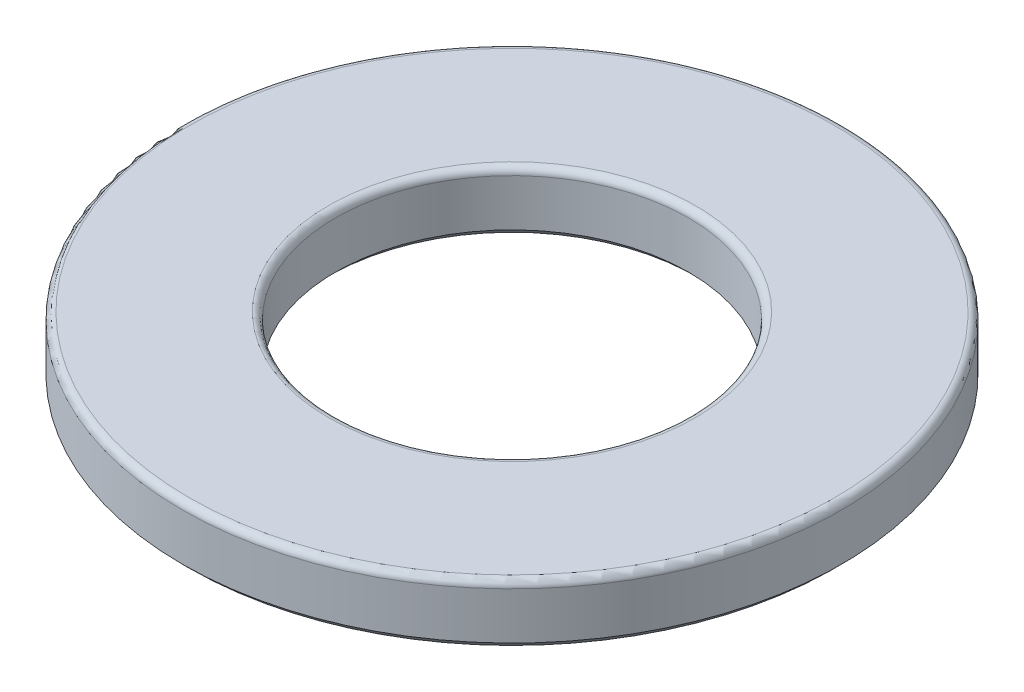
ISO-10303-21;
HEADER;
FILE_DESCRIPTION(('STEP AP214'),'2;1');
FILE_NAME('part.step','',(''),(''),'','','');
FILE_SCHEMA(('AUTOMOTIVE_DESIGN { 1 0 10303 214 1 1 1 1 }'));
ENDSEC;
DATA;
#1=APPLICATION_CONTEXT('core data for automotive mechanical design processes');
#2=APPLICATION_PROTOCOL_DEFINITION('international standard','automotive_design',2000,#1);
#3=PRODUCT_CONTEXT('',#1,'mechanical');
#4=PRODUCT('Part','Part','',(#3));
#5=PRODUCT_RELATED_PRODUCT_CATEGORY('part','',(#4));
#6=PRODUCT_DEFINITION_FORMATION('','',#4);
#7=PRODUCT_DEFINITION_CONTEXT('part definition',#1,'design');
#8=PRODUCT_DEFINITION('design','',#6,#7);
#9=PRODUCT_DEFINITION_SHAPE('','',#8);
#10=(LENGTH_UNIT() NAMED_UNIT(*) SI_UNIT(.MILLI.,.METRE.));
#11=(NAMED_UNIT(*) PLANE_ANGLE_UNIT() SI_UNIT($,.RADIAN.));
#12=(NAMED_UNIT(*) SI_UNIT($,.STERADIAN.) SOLID_ANGLE_UNIT());
#13=UNCERTAINTY_MEASURE_WITH_UNIT(LENGTH_MEASURE(1.E-05),#10,'distance_accuracy_value','');
#14=(GEOMETRIC_REPRESENTATION_CONTEXT(3) GLOBAL_UNCERTAINTY_ASSIGNED_CONTEXT((#13)) GLOBAL_UNIT_ASSIGNED_CONTEXT((#10,
#11,#12)) REPRESENTATION_CONTEXT('',''));
#15=CARTESIAN_POINT('',(0.,0.,0.));
#16=DIRECTION('',(0.,0.,1.));
#17=DIRECTION('',(1.,0.,0.));
#18=AXIS2_PLACEMENT_3D('',#15,#16,#17);
#19=CARTESIAN_POINT('',(0.,8.7,0.));
#20=DIRECTION('',(0.,1.,0.));
#21=DIRECTION('',(0.,0.,1.));
#22=AXIS2_PLACEMENT_3D('',#19,#20,#21);
#23=TOROIDAL_SURFACE('',#22,13.7,0.3);
#24=CARTESIAN_POINT('',(0.,8.7,0.));
#25=DIRECTION('',(0.,1.,0.));
#26=DIRECTION('',(0.,0.,1.));
#27=AXIS2_PLACEMENT_3D('',#24,#25,#26);
#28=CIRCLE('',#27,14.);
#29=CARTESIAN_POINT('',(0.,8.7,14.));
#30=VERTEX_POINT('',#29);
#31=EDGE_CURVE('E10',#30,#30,#28,.T.);
#32=ORIENTED_EDGE('',*,*,#31,.T.);
#33=EDGE_LOOP('',(#32));
#34=FACE_BOUND('',#33,.T.);
#35=CARTESIAN_POINT('',(0.,9.,0.));
#36=DIRECTION('',(0.,1.,0.));
#37=DIRECTION('',(0.,0.,1.));
#38=AXIS2_PLACEMENT_3D('',#35,#36,#37);
#39=CIRCLE('',#38,13.7);
#40=CARTESIAN_POINT('',(0.,9.,13.7));
#41=VERTEX_POINT('',#40);
#42=EDGE_CURVE('E64',#41,#41,#39,.T.);
#43=ORIENTED_EDGE('',*,*,#42,.F.);
#44=EDGE_LOOP('',(#43));
#45=FACE_BOUND('',#44,.T.);
#46=ADVANCED_FACE('F14',(#34,#45),#23,.T.);
#47=CARTESIAN_POINT('',(0.,9.,0.));
#48=DIRECTION('',(0.,1.,0.));
#49=DIRECTION('',(0.,0.,1.));
#50=AXIS2_PLACEMENT_3D('',#47,#48,#49);
#51=CYLINDRICAL_SURFACE('',#50,14.);
#52=CARTESIAN_POINT('',(0.,6.7048,0.));
#53=DIRECTION('',(0.,1.,0.));
#54=DIRECTION('',(0.,0.,1.));
#55=AXIS2_PLACEMENT_3D('',#52,#53,#54);
#56=CIRCLE('',#55,14.);
#57=CARTESIAN_POINT('',(0.,6.7048,14.));
#58=VERTEX_POINT('',#57);
#59=EDGE_CURVE('E21',#58,#58,#56,.T.);
#60=ORIENTED_EDGE('',*,*,#59,.T.);
#61=EDGE_LOOP('',(#60));
#62=FACE_BOUND('',#61,.T.);
#63=ORIENTED_EDGE('',*,*,#31,.F.);
#64=EDGE_LOOP('',(#63));
#65=FACE_BOUND('',#64,.T.);
#66=ADVANCED_FACE('F73',(#62,#65),#51,.T.);
#67=CARTESIAN_POINT('',(0.,6.4048,0.));
#68=DIRECTION('',(0.,1.,0.));
#69=DIRECTION('',(0.,0.,1.));
#70=AXIS2_PLACEMENT_3D('',#67,#68,#69);
#71=CONICAL_SURFACE('',#70,13.7,0.785398163397449);
#72=ORIENTED_EDGE('',*,*,#59,.F.);
#73=EDGE_LOOP('',(#72));
#74=FACE_BOUND('',#73,.T.);
#75=CARTESIAN_POINT('',(0.,6.4048,0.));
#76=DIRECTION('',(0.,1.,0.));
#77=DIRECTION('',(0.,0.,1.));
#78=AXIS2_PLACEMENT_3D('',#75,#76,#77);
#79=CIRCLE('',#78,13.7);
#80=CARTESIAN_POINT('',(0.,6.4048,13.7));
#81=VERTEX_POINT('',#80);
#82=EDGE_CURVE('E30',#81,#81,#79,.T.);
#83=ORIENTED_EDGE('',*,*,#82,.T.);
#84=EDGE_LOOP('',(#83));
#85=FACE_BOUND('',#84,.T.);
#86=ADVANCED_FACE('F78',(#74,#85),#71,.T.);
#87=CARTESIAN_POINT('',(12.1786,6.4048,0.));
#88=DIRECTION('',(0.,1.,0.));
#89=DIRECTION('',(0.,0.,1.));
#90=AXIS2_PLACEMENT_3D('',#87,#88,#89);
#91=PLANE('',#90);
#92=ORIENTED_EDGE('',*,*,#82,.F.);
#93=EDGE_LOOP('',(#92));
#94=FACE_BOUND('',#93,.T.);
#95=CARTESIAN_POINT('',(0.,6.4048,0.));
#96=DIRECTION('',(0.,1.,0.));
#97=DIRECTION('',(0.,0.,1.));
#98=AXIS2_PLACEMENT_3D('',#95,#96,#97);
#99=CIRCLE('',#98,12.1786);
#100=CARTESIAN_POINT('',(0.,6.4048,12.1786));
#101=VERTEX_POINT('',#100);
#102=EDGE_CURVE('E38',#101,#101,#99,.T.);
#103=ORIENTED_EDGE('',*,*,#102,.T.);
#104=EDGE_LOOP('',(#103));
#105=FACE_BOUND('',#104,.T.);
#106=ADVANCED_FACE('F82',(#94,#105),#91,.F.);
#107=CARTESIAN_POINT('',(0.,4.5,0.));
#108=DIRECTION('',(0.,1.,0.));
#109=DIRECTION('',(0.,0.,1.));
#110=AXIS2_PLACEMENT_3D('',#107,#108,#109);
#111=TOROIDAL_SURFACE('',#110,10.75,2.381);
#112=ORIENTED_EDGE('',*,*,#102,.F.);
#113=EDGE_LOOP('',(#112));
#114=FACE_BOUND('',#113,.T.);
#115=CARTESIAN_POINT('',(0.,6.4048,0.));
#116=DIRECTION('',(0.,1.,0.));
#117=DIRECTION('',(0.,0.,1.));
#118=AXIS2_PLACEMENT_3D('',#115,#116,#117);
#119=CIRCLE('',#118,9.3214);
#120=CARTESIAN_POINT('',(0.,6.4048,9.3214));
#121=VERTEX_POINT('',#120);
#122=EDGE_CURVE('E44',#121,#121,#119,.T.);
#123=ORIENTED_EDGE('',*,*,#122,.T.);
#124=EDGE_LOOP('',(#123));
#125=FACE_BOUND('',#124,.T.);
#126=ADVANCED_FACE('F89',(#114,#125),#111,.F.);
#127=CARTESIAN_POINT('',(7.8,6.4048,0.));
#128=DIRECTION('',(0.,1.,0.));
#129=DIRECTION('',(0.,0.,1.));
#130=AXIS2_PLACEMENT_3D('',#127,#128,#129);
#131=PLANE('',#130);
#132=ORIENTED_EDGE('',*,*,#122,.F.);
#133=EDGE_LOOP('',(#132));
#134=FACE_BOUND('',#133,.T.);
#135=CARTESIAN_POINT('',(0.,6.4048,0.));
#136=DIRECTION('',(0.,1.,0.));
#137=DIRECTION('',(0.,0.,1.));
#138=AXIS2_PLACEMENT_3D('',#135,#136,#137);
#139=CIRCLE('',#138,7.8);
#140=CARTESIAN_POINT('',(0.,6.4048,7.8));
#141=VERTEX_POINT('',#140);
#142=EDGE_CURVE('E48',#141,#141,#139,.T.);
#143=ORIENTED_EDGE('',*,*,#142,.T.);
#144=EDGE_LOOP('',(#143));
#145=FACE_BOUND('',#144,.T.);
#146=ADVANCED_FACE('F93',(#134,#145),#131,.F.);
#147=CARTESIAN_POINT('',(0.,6.7048,0.));
#148=DIRECTION('',(0.,-1.,0.));
#149=DIRECTION('',(0.,0.,-1.));
#150=AXIS2_PLACEMENT_3D('',#147,#148,#149);
#151=CONICAL_SURFACE('',#150,7.5,0.78539816339745);
#152=ORIENTED_EDGE('',*,*,#142,.F.);
#153=EDGE_LOOP('',(#152));
#154=FACE_BOUND('',#153,.T.);
#155=CARTESIAN_POINT('',(0.,6.7048,0.));
#156=DIRECTION('',(0.,1.,0.));
#157=DIRECTION('',(0.,0.,1.));
#158=AXIS2_PLACEMENT_3D('',#155,#156,#157);
#159=CIRCLE('',#158,7.5);
#160=CARTESIAN_POINT('',(0.,6.7048,7.5));
#161=VERTEX_POINT('',#160);
#162=EDGE_CURVE('E52',#161,#161,#159,.T.);
#163=ORIENTED_EDGE('',*,*,#162,.T.);
#164=EDGE_LOOP('',(#163));
#165=FACE_BOUND('',#164,.T.);
#166=ADVANCED_FACE('F97',(#154,#165),#151,.F.);
#167=CARTESIAN_POINT('',(0.,9.,0.));
#168=DIRECTION('',(0.,1.,0.));
#169=DIRECTION('',(0.,0.,1.));
#170=AXIS2_PLACEMENT_3D('',#167,#168,#169);
#171=CYLINDRICAL_SURFACE('',#170,7.5);
#172=ORIENTED_EDGE('',*,*,#162,.F.);
#173=EDGE_LOOP('',(#172));
#174=FACE_BOUND('',#173,.T.);
#175=CARTESIAN_POINT('',(0.,8.7,0.));
#176=DIRECTION('',(0.,1.,0.));
#177=DIRECTION('',(0.,0.,1.));
#178=AXIS2_PLACEMENT_3D('',#175,#176,#177);
#179=CIRCLE('',#178,7.5);
#180=CARTESIAN_POINT('',(0.,8.7,7.5));
#181=VERTEX_POINT('',#180);
#182=EDGE_CURVE('E56',#181,#181,#179,.T.);
#183=ORIENTED_EDGE('',*,*,#182,.T.);
#184=EDGE_LOOP('',(#183));
#185=FACE_BOUND('',#184,.T.);
#186=ADVANCED_FACE('F101',(#174,#185),#171,.F.);
#187=CARTESIAN_POINT('',(0.,8.7,0.));
#188=DIRECTION('',(0.,1.,0.));
#189=DIRECTION('',(0.,0.,1.));
#190=AXIS2_PLACEMENT_3D('',#187,#188,#189);
#191=TOROIDAL_SURFACE('',#190,7.8,0.3);
#192=CARTESIAN_POINT('',(0.,9.,0.));
#193=DIRECTION('',(0.,1.,0.));
#194=DIRECTION('',(0.,0.,1.));
#195=AXIS2_PLACEMENT_3D('',#192,#193,#194);
#196=CIRCLE('',#195,7.8);
#197=CARTESIAN_POINT('',(0.,9.,7.8));
#198=VERTEX_POINT('',#197);
#199=EDGE_CURVE('E60',#198,#198,#196,.T.);
#200=ORIENTED_EDGE('',*,*,#199,.T.);
#201=EDGE_LOOP('',(#200));
#202=FACE_BOUND('',#201,.T.);
#203=ORIENTED_EDGE('',*,*,#182,.F.);
#204=EDGE_LOOP('',(#203));
#205=FACE_BOUND('',#204,.T.);
#206=ADVANCED_FACE('F105',(#202,#205),#191,.T.);
#207=CARTESIAN_POINT('',(7.8,9.,0.));
#208=DIRECTION('',(0.,1.,0.));
#209=DIRECTION('',(0.,0.,1.));
#210=AXIS2_PLACEMENT_3D('',#207,#208,#209);
#211=PLANE('',#210);
#212=ORIENTED_EDGE('',*,*,#42,.T.);
#213=EDGE_LOOP('',(#212));
#214=FACE_BOUND('',#213,.T.);
#215=ORIENTED_EDGE('',*,*,#199,.F.);
#216=EDGE_LOOP('',(#215));
#217=FACE_BOUND('',#216,.T.);
#218=ADVANCED_FACE('F69',(#214,#217),#211,.T.);
#219=CLOSED_SHELL('',(#46,#66,#86,#106,#126,#146,#166,#186,#206,#218));
#220=MANIFOLD_SOLID_BREP('B1',#219);
#221=ADVANCED_BREP_SHAPE_REPRESENTATION('',(#18,#220),#14);
#222=SHAPE_DEFINITION_REPRESENTATION(#9,#221);
ENDSEC;
END-ISO-10303-21;
